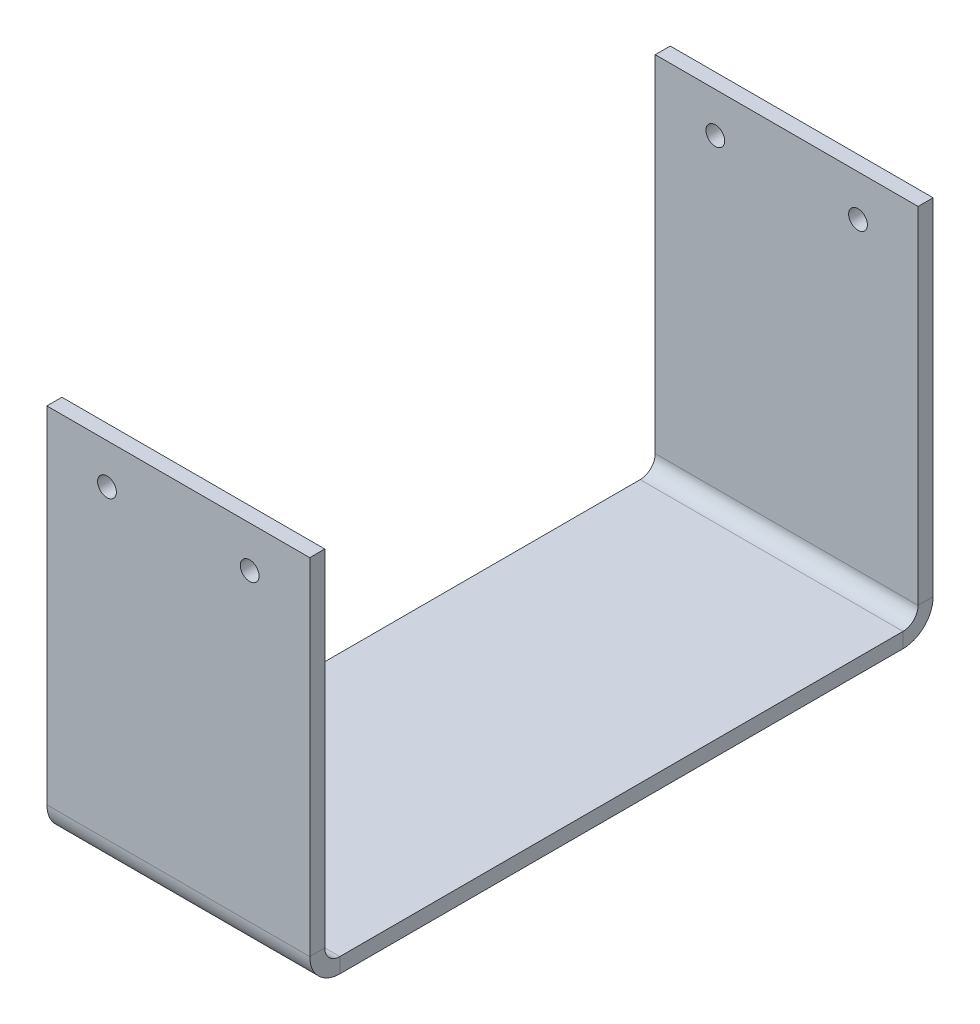
ISO-10303-21;
HEADER;
FILE_DESCRIPTION(('STEP AP214'),'2;1');
FILE_NAME('part.step','',(''),(''),'','','');
FILE_SCHEMA(('AUTOMOTIVE_DESIGN { 1 0 10303 214 1 1 1 1 }'));
ENDSEC;
DATA;
#1=APPLICATION_CONTEXT('core data for automotive mechanical design processes');
#2=APPLICATION_PROTOCOL_DEFINITION('international standard','automotive_design',2000,#1);
#3=PRODUCT_CONTEXT('',#1,'mechanical');
#4=PRODUCT('Part','Part','',(#3));
#5=PRODUCT_RELATED_PRODUCT_CATEGORY('part','',(#4));
#6=PRODUCT_DEFINITION_FORMATION('','',#4);
#7=PRODUCT_DEFINITION_CONTEXT('part definition',#1,'design');
#8=PRODUCT_DEFINITION('design','',#6,#7);
#9=PRODUCT_DEFINITION_SHAPE('','',#8);
#10=(LENGTH_UNIT() NAMED_UNIT(*) SI_UNIT(.MILLI.,.METRE.));
#11=(NAMED_UNIT(*) PLANE_ANGLE_UNIT() SI_UNIT($,.RADIAN.));
#12=(NAMED_UNIT(*) SI_UNIT($,.STERADIAN.) SOLID_ANGLE_UNIT());
#13=UNCERTAINTY_MEASURE_WITH_UNIT(LENGTH_MEASURE(1.E-05),#10,'distance_accuracy_value','');
#14=(GEOMETRIC_REPRESENTATION_CONTEXT(3) GLOBAL_UNCERTAINTY_ASSIGNED_CONTEXT((#13)) GLOBAL_UNIT_ASSIGNED_CONTEXT((#10,
#11,#12)) REPRESENTATION_CONTEXT('',''));
#15=CARTESIAN_POINT('',(0.,0.,0.));
#16=DIRECTION('',(0.,0.,1.));
#17=DIRECTION('',(1.,0.,0.));
#18=AXIS2_PLACEMENT_3D('',#15,#16,#17);
#19=CARTESIAN_POINT('',(0.,-2.,0.));
#20=DIRECTION('',(0.,1.,0.));
#21=DIRECTION('',(0.,0.,1.));
#22=AXIS2_PLACEMENT_3D('',#19,#20,#21);
#23=PLANE('',#22);
#24=DIRECTION('',(1.,0.,0.));
#25=VECTOR('',#24,1.);
#26=CARTESIAN_POINT('',(17.5,-2.00000000000001,37.5));
#27=LINE('',#26,#25);
#28=CARTESIAN_POINT('',(17.5,-2.00000000000001,37.5));
#29=VERTEX_POINT('',#28);
#30=CARTESIAN_POINT('',(-17.5,-2.,37.5));
#31=VERTEX_POINT('',#30);
#32=EDGE_CURVE('E210',#29,#31,#27,.F.);
#33=ORIENTED_EDGE('',*,*,#32,.T.);
#34=DIRECTION('',(0.,0.,1.));
#35=VECTOR('',#34,1.);
#36=CARTESIAN_POINT('',(-17.5,-2.,-41.5));
#37=LINE('',#36,#35);
#38=CARTESIAN_POINT('',(-17.5,-2.00000000000002,-37.5));
#39=VERTEX_POINT('',#38);
#40=EDGE_CURVE('E13',#39,#31,#37,.T.);
#41=ORIENTED_EDGE('',*,*,#40,.F.);
#42=DIRECTION('',(-1.,0.,0.));
#43=VECTOR('',#42,1.);
#44=CARTESIAN_POINT('',(-17.5,-2.00000000000002,-37.5));
#45=LINE('',#44,#43);
#46=CARTESIAN_POINT('',(17.5,-2.,-37.5));
#47=VERTEX_POINT('',#46);
#48=EDGE_CURVE('E263',#39,#47,#45,.F.);
#49=ORIENTED_EDGE('',*,*,#48,.T.);
#50=DIRECTION('',(0.,0.,-1.));
#51=VECTOR('',#50,1.);
#52=CARTESIAN_POINT('',(17.5,-2.,-41.5));
#53=LINE('',#52,#51);
#54=EDGE_CURVE('E85',#29,#47,#53,.T.);
#55=ORIENTED_EDGE('',*,*,#54,.F.);
#56=EDGE_LOOP('',(#33,#41,#49,#55));
#57=FACE_BOUND('',#56,.T.);
#58=ADVANCED_FACE('F76',(#57),#23,.F.);
#59=CARTESIAN_POINT('',(0.,0.,0.));
#60=DIRECTION('',(0.,1.,0.));
#61=DIRECTION('',(0.,0.,1.));
#62=AXIS2_PLACEMENT_3D('',#59,#60,#61);
#63=PLANE('',#62);
#64=DIRECTION('',(0.,0.,1.));
#65=VECTOR('',#64,1.);
#66=CARTESIAN_POINT('',(-17.5,0.,-41.5));
#67=LINE('',#66,#65);
#68=CARTESIAN_POINT('',(-17.5,0.,-37.5));
#69=VERTEX_POINT('',#68);
#70=CARTESIAN_POINT('',(-17.5,0.,37.5));
#71=VERTEX_POINT('',#70);
#72=EDGE_CURVE('E80',#69,#71,#67,.T.);
#73=ORIENTED_EDGE('',*,*,#72,.T.);
#74=DIRECTION('',(1.,0.,0.));
#75=VECTOR('',#74,1.);
#76=CARTESIAN_POINT('',(17.5,0.,37.5));
#77=LINE('',#76,#75);
#78=CARTESIAN_POINT('',(17.5,0.,37.5));
#79=VERTEX_POINT('',#78);
#80=EDGE_CURVE('E222',#79,#71,#77,.F.);
#81=ORIENTED_EDGE('',*,*,#80,.F.);
#82=DIRECTION('',(0.,0.,-1.));
#83=VECTOR('',#82,1.);
#84=CARTESIAN_POINT('',(17.5,0.,-41.5));
#85=LINE('',#84,#83);
#86=CARTESIAN_POINT('',(17.5,0.,-37.5));
#87=VERTEX_POINT('',#86);
#88=EDGE_CURVE('E281',#79,#87,#85,.T.);
#89=ORIENTED_EDGE('',*,*,#88,.T.);
#90=DIRECTION('',(-1.,0.,0.));
#91=VECTOR('',#90,1.);
#92=CARTESIAN_POINT('',(-17.5,0.,-37.5));
#93=LINE('',#92,#91);
#94=EDGE_CURVE('E93',#69,#87,#93,.F.);
#95=ORIENTED_EDGE('',*,*,#94,.F.);
#96=EDGE_LOOP('',(#73,#81,#89,#95));
#97=FACE_BOUND('',#96,.T.);
#98=ADVANCED_FACE('F285',(#97),#63,.T.);
#99=CARTESIAN_POINT('',(17.5,-2.,-41.5));
#100=DIRECTION('',(1.,0.,0.));
#101=DIRECTION('',(0.,0.,-1.));
#102=AXIS2_PLACEMENT_3D('',#99,#100,#101);
#103=PLANE('',#102);
#104=ORIENTED_EDGE('',*,*,#88,.F.);
#105=DIRECTION('',(0.,-1.,0.));
#106=VECTOR('',#105,1.);
#107=CARTESIAN_POINT('',(17.5,0.,37.5));
#108=LINE('',#107,#106);
#109=EDGE_CURVE('E216',#79,#29,#108,.T.);
#110=ORIENTED_EDGE('',*,*,#109,.T.);
#111=ORIENTED_EDGE('',*,*,#54,.T.);
#112=DIRECTION('',(0.,-1.,0.));
#113=VECTOR('',#112,1.);
#114=CARTESIAN_POINT('',(17.5,0.,-37.5));
#115=LINE('',#114,#113);
#116=EDGE_CURVE('E278',#87,#47,#115,.T.);
#117=ORIENTED_EDGE('',*,*,#116,.F.);
#118=EDGE_LOOP('',(#104,#110,#111,#117));
#119=FACE_BOUND('',#118,.T.);
#120=ADVANCED_FACE('F78',(#119),#103,.T.);
#121=CARTESIAN_POINT('',(-17.5,-2.,-41.5));
#122=DIRECTION('',(-1.,0.,0.));
#123=DIRECTION('',(0.,0.,1.));
#124=AXIS2_PLACEMENT_3D('',#121,#122,#123);
#125=PLANE('',#124);
#126=DIRECTION('',(0.,-1.,0.));
#127=VECTOR('',#126,1.);
#128=CARTESIAN_POINT('',(-17.5,0.,37.5));
#129=LINE('',#128,#127);
#130=EDGE_CURVE('E228',#71,#31,#129,.T.);
#131=ORIENTED_EDGE('',*,*,#130,.F.);
#132=ORIENTED_EDGE('',*,*,#72,.F.);
#133=DIRECTION('',(0.,-1.,0.));
#134=VECTOR('',#133,1.);
#135=CARTESIAN_POINT('',(-17.5,0.,-37.5));
#136=LINE('',#135,#134);
#137=EDGE_CURVE('E269',#69,#39,#136,.T.);
#138=ORIENTED_EDGE('',*,*,#137,.T.);
#139=ORIENTED_EDGE('',*,*,#40,.T.);
#140=EDGE_LOOP('',(#131,#132,#138,#139));
#141=FACE_BOUND('',#140,.T.);
#142=ADVANCED_FACE('F355',(#141),#125,.T.);
#143=CARTESIAN_POINT('',(17.5,1.99999999999998,-37.5));
#144=DIRECTION('',(1.,0.,0.));
#145=DIRECTION('',(0.,0.,-1.));
#146=AXIS2_PLACEMENT_3D('',#143,#144,#145);
#147=PLANE('',#146);
#148=DIRECTION('',(0.,0.,1.));
#149=VECTOR('',#148,1.);
#150=CARTESIAN_POINT('',(17.5,2.00000000000001,-41.5));
#151=LINE('',#150,#149);
#152=CARTESIAN_POINT('',(17.5,1.99999999999997,-39.5));
#153=VERTEX_POINT('',#152);
#154=CARTESIAN_POINT('',(17.5,1.99999999999997,-41.5));
#155=VERTEX_POINT('',#154);
#156=EDGE_CURVE('E231',#153,#155,#151,.F.);
#157=ORIENTED_EDGE('',*,*,#156,.F.);
#158=CARTESIAN_POINT('',(17.5,1.99999999999998,-37.5));
#159=DIRECTION('',(-1.,0.,0.));
#160=DIRECTION('',(0.,0.,1.));
#161=AXIS2_PLACEMENT_3D('',#158,#159,#160);
#162=CIRCLE('',#161,2.);
#163=EDGE_CURVE('E272',#87,#153,#162,.F.);
#164=ORIENTED_EDGE('',*,*,#163,.F.);
#165=ORIENTED_EDGE('',*,*,#116,.T.);
#166=CARTESIAN_POINT('',(17.5,1.99999999999998,-37.5));
#167=DIRECTION('',(-1.,0.,0.));
#168=DIRECTION('',(0.,0.,1.));
#169=AXIS2_PLACEMENT_3D('',#166,#167,#168);
#170=CIRCLE('',#169,4.);
#171=EDGE_CURVE('E265',#47,#155,#170,.F.);
#172=ORIENTED_EDGE('',*,*,#171,.T.);
#173=EDGE_LOOP('',(#157,#164,#165,#172));
#174=FACE_BOUND('',#173,.T.);
#175=ADVANCED_FACE('F357',(#174),#147,.T.);
#176=CARTESIAN_POINT('',(-17.5,1.99999999999998,-37.5));
#177=DIRECTION('',(1.,0.,0.));
#178=DIRECTION('',(0.,0.,-1.));
#179=AXIS2_PLACEMENT_3D('',#176,#177,#178);
#180=PLANE('',#179);
#181=CARTESIAN_POINT('',(-17.5,1.99999999999998,-37.5));
#182=DIRECTION('',(-1.,0.,0.));
#183=DIRECTION('',(0.,0.,1.));
#184=AXIS2_PLACEMENT_3D('',#181,#182,#183);
#185=CIRCLE('',#184,2.);
#186=CARTESIAN_POINT('',(-17.5,1.99999999999997,-39.5));
#187=VERTEX_POINT('',#186);
#188=EDGE_CURVE('E236',#187,#69,#185,.T.);
#189=ORIENTED_EDGE('',*,*,#188,.F.);
#190=DIRECTION('',(0.,0.,1.));
#191=VECTOR('',#190,1.);
#192=CARTESIAN_POINT('',(-17.5,1.99999999999999,-39.5));
#193=LINE('',#192,#191);
#194=CARTESIAN_POINT('',(-17.5,2.00000000000001,-41.5));
#195=VERTEX_POINT('',#194);
#196=EDGE_CURVE('E256',#187,#195,#193,.F.);
#197=ORIENTED_EDGE('',*,*,#196,.T.);
#198=CARTESIAN_POINT('',(-17.5,1.99999999999998,-37.5));
#199=DIRECTION('',(-1.,0.,0.));
#200=DIRECTION('',(0.,0.,1.));
#201=AXIS2_PLACEMENT_3D('',#198,#199,#200);
#202=CIRCLE('',#201,4.);
#203=EDGE_CURVE('E266',#195,#39,#202,.T.);
#204=ORIENTED_EDGE('',*,*,#203,.T.);
#205=ORIENTED_EDGE('',*,*,#137,.F.);
#206=EDGE_LOOP('',(#189,#197,#204,#205));
#207=FACE_BOUND('',#206,.T.);
#208=ADVANCED_FACE('F353',(#207),#180,.F.);
#209=CARTESIAN_POINT('',(-17.5,1.99999999999998,-37.5));
#210=DIRECTION('',(-1.,0.,0.));
#211=DIRECTION('',(0.,0.,-1.));
#212=AXIS2_PLACEMENT_3D('',#209,#210,#211);
#213=CYLINDRICAL_SURFACE('',#212,4.);
#214=ORIENTED_EDGE('',*,*,#48,.F.);
#215=ORIENTED_EDGE('',*,*,#203,.F.);
#216=DIRECTION('',(-1.,0.,0.));
#217=VECTOR('',#216,1.);
#218=CARTESIAN_POINT('',(17.5,2.00000000000001,-41.5));
#219=LINE('',#218,#217);
#220=EDGE_CURVE('E254',#195,#155,#219,.F.);
#221=ORIENTED_EDGE('',*,*,#220,.T.);
#222=ORIENTED_EDGE('',*,*,#171,.F.);
#223=EDGE_LOOP('',(#214,#215,#221,#222));
#224=FACE_BOUND('',#223,.T.);
#225=ADVANCED_FACE('F398',(#224),#213,.T.);
#226=CARTESIAN_POINT('',(-17.5,1.99999999999998,-37.5));
#227=DIRECTION('',(-1.,0.,0.));
#228=DIRECTION('',(0.,0.,-1.));
#229=AXIS2_PLACEMENT_3D('',#226,#227,#228);
#230=CYLINDRICAL_SURFACE('',#229,2.);
#231=ORIENTED_EDGE('',*,*,#94,.T.);
#232=ORIENTED_EDGE('',*,*,#163,.T.);
#233=DIRECTION('',(-1.,0.,0.));
#234=VECTOR('',#233,1.);
#235=CARTESIAN_POINT('',(17.5,1.99999999999999,-39.5));
#236=LINE('',#235,#234);
#237=EDGE_CURVE('E259',#153,#187,#236,.T.);
#238=ORIENTED_EDGE('',*,*,#237,.T.);
#239=ORIENTED_EDGE('',*,*,#188,.T.);
#240=EDGE_LOOP('',(#231,#232,#238,#239));
#241=FACE_BOUND('',#240,.T.);
#242=ADVANCED_FACE('F396',(#241),#230,.F.);
#243=CARTESIAN_POINT('',(17.5,0.,-41.5));
#244=DIRECTION('',(-1.,0.,0.));
#245=DIRECTION('',(0.,0.,1.));
#246=AXIS2_PLACEMENT_3D('',#243,#244,#245);
#247=PLANE('',#246);
#248=ORIENTED_EDGE('',*,*,#156,.T.);
#249=DIRECTION('',(0.,-1.,0.));
#250=VECTOR('',#249,1.);
#251=CARTESIAN_POINT('',(17.5,-1.50965011183761E-13,-41.5));
#252=LINE('',#251,#250);
#253=CARTESIAN_POINT('',(17.5,48.,-41.5000000000002));
#254=VERTEX_POINT('',#253);
#255=EDGE_CURVE('E244',#254,#155,#252,.T.);
#256=ORIENTED_EDGE('',*,*,#255,.F.);
#257=DIRECTION('',(0.,0.,1.));
#258=VECTOR('',#257,1.);
#259=CARTESIAN_POINT('',(17.5,48.,-41.5000000000002));
#260=LINE('',#259,#258);
#261=CARTESIAN_POINT('',(17.5,48.,-39.5000000000002));
#262=VERTEX_POINT('',#261);
#263=EDGE_CURVE('E237',#254,#262,#260,.T.);
#264=ORIENTED_EDGE('',*,*,#263,.T.);
#265=DIRECTION('',(0.,1.,0.));
#266=VECTOR('',#265,1.);
#267=CARTESIAN_POINT('',(17.5,0.,-39.5));
#268=LINE('',#267,#266);
#269=EDGE_CURVE('E251',#262,#153,#268,.F.);
#270=ORIENTED_EDGE('',*,*,#269,.T.);
#271=EDGE_LOOP('',(#248,#256,#264,#270));
#272=FACE_BOUND('',#271,.T.);
#273=ADVANCED_FACE('F392',(#272),#247,.F.);
#274=CARTESIAN_POINT('',(-17.5,48.,-41.5000000000002));
#275=DIRECTION('',(1.,0.,0.));
#276=DIRECTION('',(0.,1.,0.));
#277=AXIS2_PLACEMENT_3D('',#274,#275,#276);
#278=PLANE('',#277);
#279=ORIENTED_EDGE('',*,*,#196,.F.);
#280=DIRECTION('',(0.,-1.,0.));
#281=VECTOR('',#280,1.);
#282=CARTESIAN_POINT('',(-17.5,48.,-39.5000000000002));
#283=LINE('',#282,#281);
#284=CARTESIAN_POINT('',(-17.5,48.,-39.5000000000002));
#285=VERTEX_POINT('',#284);
#286=EDGE_CURVE('E249',#187,#285,#283,.F.);
#287=ORIENTED_EDGE('',*,*,#286,.T.);
#288=DIRECTION('',(0.,0.,1.));
#289=VECTOR('',#288,1.);
#290=CARTESIAN_POINT('',(-17.5,48.,-41.5000000000002));
#291=LINE('',#290,#289);
#292=CARTESIAN_POINT('',(-17.5,48.,-41.5000000000002));
#293=VERTEX_POINT('',#292);
#294=EDGE_CURVE('E233',#293,#285,#291,.T.);
#295=ORIENTED_EDGE('',*,*,#294,.F.);
#296=DIRECTION('',(0.,1.,0.));
#297=VECTOR('',#296,1.);
#298=CARTESIAN_POINT('',(-17.5,-1.48435206114628E-13,-41.5));
#299=LINE('',#298,#297);
#300=EDGE_CURVE('E242',#195,#293,#299,.T.);
#301=ORIENTED_EDGE('',*,*,#300,.F.);
#302=EDGE_LOOP('',(#279,#287,#295,#301));
#303=FACE_BOUND('',#302,.T.);
#304=ADVANCED_FACE('F382',(#303),#278,.F.);
#305=CARTESIAN_POINT('',(0.,-1.50965011183761E-13,-41.5));
#306=DIRECTION('',(0.,0.,1.));
#307=DIRECTION('',(0.,-1.,0.));
#308=AXIS2_PLACEMENT_3D('',#305,#306,#307);
#309=PLANE('',#308);
#310=CARTESIAN_POINT('',(9.5,42.5,-41.5000000000001));
#311=DIRECTION('',(0.,0.,1.));
#312=DIRECTION('',(0.,-1.,0.));
#313=AXIS2_PLACEMENT_3D('',#310,#311,#312);
#314=CIRCLE('',#313,1.24999999999998);
#315=CARTESIAN_POINT('',(9.5,41.25,-41.5000000000001));
#316=VERTEX_POINT('',#315);
#317=EDGE_CURVE('E319',#316,#316,#314,.T.);
#318=ORIENTED_EDGE('',*,*,#317,.T.);
#319=EDGE_LOOP('',(#318));
#320=FACE_BOUND('',#319,.T.);
#321=CARTESIAN_POINT('',(-9.50000000000001,42.6701090036128,-41.5000000000001));
#322=DIRECTION('',(0.,0.,1.));
#323=DIRECTION('',(0.,-1.,0.));
#324=AXIS2_PLACEMENT_3D('',#321,#322,#323);
#325=CIRCLE('',#324,1.24999999999998);
#326=CARTESIAN_POINT('',(-9.50000000000001,41.4201090036128,-41.5000000000001));
#327=VERTEX_POINT('',#326);
#328=EDGE_CURVE('E209',#327,#327,#325,.T.);
#329=ORIENTED_EDGE('',*,*,#328,.T.);
#330=EDGE_LOOP('',(#329));
#331=FACE_BOUND('',#330,.T.);
#332=ORIENTED_EDGE('',*,*,#220,.F.);
#333=ORIENTED_EDGE('',*,*,#300,.T.);
#334=DIRECTION('',(1.,0.,0.));
#335=VECTOR('',#334,1.);
#336=CARTESIAN_POINT('',(0.,48.,-41.5000000000002));
#337=LINE('',#336,#335);
#338=EDGE_CURVE('E240',#293,#254,#337,.T.);
#339=ORIENTED_EDGE('',*,*,#338,.T.);
#340=ORIENTED_EDGE('',*,*,#255,.T.);
#341=EDGE_LOOP('',(#332,#333,#339,#340));
#342=FACE_BOUND('',#341,.T.);
#343=ADVANCED_FACE('F378',(#320,#331,#342),#309,.F.);
#344=CARTESIAN_POINT('',(0.,-1.43982048506075E-13,-39.5));
#345=DIRECTION('',(0.,0.,1.));
#346=DIRECTION('',(0.,-1.,0.));
#347=AXIS2_PLACEMENT_3D('',#344,#345,#346);
#348=PLANE('',#347);
#349=CARTESIAN_POINT('',(9.5,42.5,-39.5000000000001));
#350=DIRECTION('',(0.,0.,1.));
#351=DIRECTION('',(0.,-1.,0.));
#352=AXIS2_PLACEMENT_3D('',#349,#350,#351);
#353=CIRCLE('',#352,1.24999999999998);
#354=CARTESIAN_POINT('',(9.5,41.25,-39.5000000000001));
#355=VERTEX_POINT('',#354);
#356=EDGE_CURVE('E316',#355,#355,#353,.T.);
#357=ORIENTED_EDGE('',*,*,#356,.F.);
#358=EDGE_LOOP('',(#357));
#359=FACE_BOUND('',#358,.T.);
#360=CARTESIAN_POINT('',(-9.50000000000001,42.6701090036128,-39.5000000000001));
#361=DIRECTION('',(0.,0.,1.));
#362=DIRECTION('',(0.,-1.,0.));
#363=AXIS2_PLACEMENT_3D('',#360,#361,#362);
#364=CIRCLE('',#363,1.24999999999998);
#365=CARTESIAN_POINT('',(-9.50000000000001,41.4201090036129,-39.5000000000001));
#366=VERTEX_POINT('',#365);
#367=EDGE_CURVE('E310',#366,#366,#364,.T.);
#368=ORIENTED_EDGE('',*,*,#367,.F.);
#369=EDGE_LOOP('',(#368));
#370=FACE_BOUND('',#369,.T.);
#371=ORIENTED_EDGE('',*,*,#286,.F.);
#372=ORIENTED_EDGE('',*,*,#237,.F.);
#373=ORIENTED_EDGE('',*,*,#269,.F.);
#374=DIRECTION('',(-1.,0.,0.));
#375=VECTOR('',#374,1.);
#376=CARTESIAN_POINT('',(17.5,48.,-39.5000000000002));
#377=LINE('',#376,#375);
#378=EDGE_CURVE('E247',#285,#262,#377,.F.);
#379=ORIENTED_EDGE('',*,*,#378,.F.);
#380=EDGE_LOOP('',(#371,#372,#373,#379));
#381=FACE_BOUND('',#380,.T.);
#382=ADVANCED_FACE('F381',(#359,#370,#381),#348,.T.);
#383=CARTESIAN_POINT('',(17.5,48.,-41.5000000000002));
#384=DIRECTION('',(0.,-1.,0.));
#385=DIRECTION('',(0.,0.,-1.));
#386=AXIS2_PLACEMENT_3D('',#383,#384,#385);
#387=PLANE('',#386);
#388=ORIENTED_EDGE('',*,*,#378,.T.);
#389=ORIENTED_EDGE('',*,*,#263,.F.);
#390=ORIENTED_EDGE('',*,*,#338,.F.);
#391=ORIENTED_EDGE('',*,*,#294,.T.);
#392=EDGE_LOOP('',(#388,#389,#390,#391));
#393=FACE_BOUND('',#392,.T.);
#394=ADVANCED_FACE('F374',(#393),#387,.F.);
#395=CARTESIAN_POINT('',(-17.5,1.99999999999999,37.5));
#396=DIRECTION('',(-1.,0.,0.));
#397=DIRECTION('',(0.,0.,1.));
#398=AXIS2_PLACEMENT_3D('',#395,#396,#397);
#399=PLANE('',#398);
#400=DIRECTION('',(0.,0.,-1.));
#401=VECTOR('',#400,1.);
#402=CARTESIAN_POINT('',(-17.5,1.99999999999999,41.5));
#403=LINE('',#402,#401);
#404=CARTESIAN_POINT('',(-17.5,1.99999999999999,39.5));
#405=VERTEX_POINT('',#404);
#406=CARTESIAN_POINT('',(-17.5,1.99999999999999,41.5));
#407=VERTEX_POINT('',#406);
#408=EDGE_CURVE('E192',#405,#407,#403,.F.);
#409=ORIENTED_EDGE('',*,*,#408,.F.);
#410=CARTESIAN_POINT('',(-17.5,1.99999999999999,37.5));
#411=DIRECTION('',(1.,0.,0.));
#412=DIRECTION('',(0.,0.,-1.));
#413=AXIS2_PLACEMENT_3D('',#410,#411,#412);
#414=CIRCLE('',#413,2.);
#415=EDGE_CURVE('E219',#71,#405,#414,.F.);
#416=ORIENTED_EDGE('',*,*,#415,.F.);
#417=ORIENTED_EDGE('',*,*,#130,.T.);
#418=CARTESIAN_POINT('',(-17.5,1.99999999999999,37.5));
#419=DIRECTION('',(1.,0.,0.));
#420=DIRECTION('',(0.,0.,-1.));
#421=AXIS2_PLACEMENT_3D('',#418,#419,#420);
#422=CIRCLE('',#421,4.);
#423=EDGE_CURVE('E212',#31,#407,#422,.F.);
#424=ORIENTED_EDGE('',*,*,#423,.T.);
#425=EDGE_LOOP('',(#409,#416,#417,#424));
#426=FACE_BOUND('',#425,.T.);
#427=ADVANCED_FACE('F294',(#426),#399,.T.);
#428=CARTESIAN_POINT('',(17.5,1.99999999999999,37.5));
#429=DIRECTION('',(-1.,0.,0.));
#430=DIRECTION('',(0.,0.,1.));
#431=AXIS2_PLACEMENT_3D('',#428,#429,#430);
#432=PLANE('',#431);
#433=CARTESIAN_POINT('',(17.5,1.99999999999999,37.5));
#434=DIRECTION('',(1.,0.,0.));
#435=DIRECTION('',(0.,0.,-1.));
#436=AXIS2_PLACEMENT_3D('',#433,#434,#435);
#437=CIRCLE('',#436,2.);
#438=CARTESIAN_POINT('',(17.5,1.99999999999999,39.5));
#439=VERTEX_POINT('',#438);
#440=EDGE_CURVE('E225',#439,#79,#437,.T.);
#441=ORIENTED_EDGE('',*,*,#440,.F.);
#442=DIRECTION('',(0.,0.,-1.));
#443=VECTOR('',#442,1.);
#444=CARTESIAN_POINT('',(17.5,1.99999999999999,39.5));
#445=LINE('',#444,#443);
#446=CARTESIAN_POINT('',(17.5,1.99999999999999,41.5));
#447=VERTEX_POINT('',#446);
#448=EDGE_CURVE('E203',#439,#447,#445,.F.);
#449=ORIENTED_EDGE('',*,*,#448,.T.);
#450=CARTESIAN_POINT('',(17.5,1.99999999999999,37.5));
#451=DIRECTION('',(1.,0.,0.));
#452=DIRECTION('',(0.,0.,-1.));
#453=AXIS2_PLACEMENT_3D('',#450,#451,#452);
#454=CIRCLE('',#453,4.);
#455=EDGE_CURVE('E213',#447,#29,#454,.T.);
#456=ORIENTED_EDGE('',*,*,#455,.T.);
#457=ORIENTED_EDGE('',*,*,#109,.F.);
#458=EDGE_LOOP('',(#441,#449,#456,#457));
#459=FACE_BOUND('',#458,.T.);
#460=ADVANCED_FACE('F366',(#459),#432,.F.);
#461=CARTESIAN_POINT('',(17.5,1.99999999999999,37.5));
#462=DIRECTION('',(1.,0.,0.));
#463=DIRECTION('',(0.,0.,1.));
#464=AXIS2_PLACEMENT_3D('',#461,#462,#463);
#465=CYLINDRICAL_SURFACE('',#464,4.);
#466=ORIENTED_EDGE('',*,*,#32,.F.);
#467=ORIENTED_EDGE('',*,*,#455,.F.);
#468=DIRECTION('',(1.,0.,0.));
#469=VECTOR('',#468,1.);
#470=CARTESIAN_POINT('',(-17.5,1.99999999999999,41.5));
#471=LINE('',#470,#469);
#472=EDGE_CURVE('E201',#447,#407,#471,.F.);
#473=ORIENTED_EDGE('',*,*,#472,.T.);
#474=ORIENTED_EDGE('',*,*,#423,.F.);
#475=EDGE_LOOP('',(#466,#467,#473,#474));
#476=FACE_BOUND('',#475,.T.);
#477=ADVANCED_FACE('F298',(#476),#465,.T.);
#478=CARTESIAN_POINT('',(17.5,1.99999999999999,37.5));
#479=DIRECTION('',(1.,0.,0.));
#480=DIRECTION('',(0.,0.,1.));
#481=AXIS2_PLACEMENT_3D('',#478,#479,#480);
#482=CYLINDRICAL_SURFACE('',#481,2.);
#483=ORIENTED_EDGE('',*,*,#80,.T.);
#484=ORIENTED_EDGE('',*,*,#415,.T.);
#485=DIRECTION('',(1.,0.,0.));
#486=VECTOR('',#485,1.);
#487=CARTESIAN_POINT('',(-17.5,1.99999999999999,39.5));
#488=LINE('',#487,#486);
#489=EDGE_CURVE('E206',#405,#439,#488,.T.);
#490=ORIENTED_EDGE('',*,*,#489,.T.);
#491=ORIENTED_EDGE('',*,*,#440,.T.);
#492=EDGE_LOOP('',(#483,#484,#490,#491));
#493=FACE_BOUND('',#492,.T.);
#494=ADVANCED_FACE('F290',(#493),#482,.F.);
#495=CARTESIAN_POINT('',(-17.5,0.,41.5));
#496=DIRECTION('',(1.,0.,0.));
#497=DIRECTION('',(0.,0.,-1.));
#498=AXIS2_PLACEMENT_3D('',#495,#496,#497);
#499=PLANE('',#498);
#500=ORIENTED_EDGE('',*,*,#408,.T.);
#501=DIRECTION('',(0.,-1.,0.));
#502=VECTOR('',#501,1.);
#503=CARTESIAN_POINT('',(-17.5,0.,41.5));
#504=LINE('',#503,#502);
#505=CARTESIAN_POINT('',(-17.5,48.,41.5));
#506=VERTEX_POINT('',#505);
#507=EDGE_CURVE('E173',#506,#407,#504,.T.);
#508=ORIENTED_EDGE('',*,*,#507,.F.);
#509=DIRECTION('',(0.,0.,-1.));
#510=VECTOR('',#509,1.);
#511=CARTESIAN_POINT('',(-17.5,48.,41.5));
#512=LINE('',#511,#510);
#513=CARTESIAN_POINT('',(-17.5,48.,39.5));
#514=VERTEX_POINT('',#513);
#515=EDGE_CURVE('E179',#506,#514,#512,.T.);
#516=ORIENTED_EDGE('',*,*,#515,.T.);
#517=DIRECTION('',(0.,1.,0.));
#518=VECTOR('',#517,1.);
#519=CARTESIAN_POINT('',(-17.5,0.,39.5));
#520=LINE('',#519,#518);
#521=EDGE_CURVE('E199',#514,#405,#520,.F.);
#522=ORIENTED_EDGE('',*,*,#521,.T.);
#523=EDGE_LOOP('',(#500,#508,#516,#522));
#524=FACE_BOUND('',#523,.T.);
#525=ADVANCED_FACE('F191',(#524),#499,.F.);
#526=CARTESIAN_POINT('',(17.5,48.,41.5));
#527=DIRECTION('',(-1.,0.,0.));
#528=DIRECTION('',(0.,-1.,0.));
#529=AXIS2_PLACEMENT_3D('',#526,#527,#528);
#530=PLANE('',#529);
#531=ORIENTED_EDGE('',*,*,#448,.F.);
#532=DIRECTION('',(0.,-1.,0.));
#533=VECTOR('',#532,1.);
#534=CARTESIAN_POINT('',(17.5,48.,39.5));
#535=LINE('',#534,#533);
#536=CARTESIAN_POINT('',(17.5,48.,39.5));
#537=VERTEX_POINT('',#536);
#538=EDGE_CURVE('E195',#439,#537,#535,.F.);
#539=ORIENTED_EDGE('',*,*,#538,.T.);
#540=DIRECTION('',(0.,0.,-1.));
#541=VECTOR('',#540,1.);
#542=CARTESIAN_POINT('',(17.5,48.,41.5));
#543=LINE('',#542,#541);
#544=CARTESIAN_POINT('',(17.5,48.,41.5));
#545=VERTEX_POINT('',#544);
#546=EDGE_CURVE('E188',#545,#537,#543,.T.);
#547=ORIENTED_EDGE('',*,*,#546,.F.);
#548=DIRECTION('',(0.,1.,0.));
#549=VECTOR('',#548,1.);
#550=CARTESIAN_POINT('',(17.5,0.,41.5));
#551=LINE('',#550,#549);
#552=EDGE_CURVE('E175',#447,#545,#551,.T.);
#553=ORIENTED_EDGE('',*,*,#552,.F.);
#554=EDGE_LOOP('',(#531,#539,#547,#553));
#555=FACE_BOUND('',#554,.T.);
#556=ADVANCED_FACE('F301',(#555),#530,.F.);
#557=CARTESIAN_POINT('',(0.,0.,41.5));
#558=DIRECTION('',(0.,0.,-1.));
#559=DIRECTION('',(-1.,0.,0.));
#560=AXIS2_PLACEMENT_3D('',#557,#558,#559);
#561=PLANE('',#560);
#562=CARTESIAN_POINT('',(9.5,42.5000000000003,41.5));
#563=DIRECTION('',(0.,0.,-1.));
#564=DIRECTION('',(0.,1.,0.));
#565=AXIS2_PLACEMENT_3D('',#562,#563,#564);
#566=CIRCLE('',#565,1.24999999999998);
#567=CARTESIAN_POINT('',(9.5,43.7500000000003,41.5));
#568=VERTEX_POINT('',#567);
#569=EDGE_CURVE('E325',#568,#568,#566,.T.);
#570=ORIENTED_EDGE('',*,*,#569,.T.);
#571=EDGE_LOOP('',(#570));
#572=FACE_BOUND('',#571,.T.);
#573=CARTESIAN_POINT('',(-9.50000000000001,42.6701090036131,41.5));
#574=DIRECTION('',(0.,0.,-1.));
#575=DIRECTION('',(0.,1.,0.));
#576=AXIS2_PLACEMENT_3D('',#573,#574,#575);
#577=CIRCLE('',#576,1.24999999999998);
#578=CARTESIAN_POINT('',(-9.50000000000001,43.9201090036131,41.5));
#579=VERTEX_POINT('',#578);
#580=EDGE_CURVE('E313',#579,#579,#577,.T.);
#581=ORIENTED_EDGE('',*,*,#580,.T.);
#582=EDGE_LOOP('',(#581));
#583=FACE_BOUND('',#582,.T.);
#584=ORIENTED_EDGE('',*,*,#472,.F.);
#585=ORIENTED_EDGE('',*,*,#552,.T.);
#586=DIRECTION('',(-1.,0.,0.));
#587=VECTOR('',#586,1.);
#588=CARTESIAN_POINT('',(0.,48.,41.5));
#589=LINE('',#588,#587);
#590=EDGE_CURVE('E168',#545,#506,#589,.T.);
#591=ORIENTED_EDGE('',*,*,#590,.T.);
#592=ORIENTED_EDGE('',*,*,#507,.T.);
#593=EDGE_LOOP('',(#584,#585,#591,#592));
#594=FACE_BOUND('',#593,.T.);
#595=ADVANCED_FACE('F171',(#572,#583,#594),#561,.F.);
#596=CARTESIAN_POINT('',(0.,0.,39.5));
#597=DIRECTION('',(0.,0.,-1.));
#598=DIRECTION('',(-1.,0.,0.));
#599=AXIS2_PLACEMENT_3D('',#596,#597,#598);
#600=PLANE('',#599);
#601=CARTESIAN_POINT('',(9.5,42.5000000000003,39.5));
#602=DIRECTION('',(0.,0.,-1.));
#603=DIRECTION('',(-1.,0.,0.));
#604=AXIS2_PLACEMENT_3D('',#601,#602,#603);
#605=CIRCLE('',#604,1.24999999999998);
#606=CARTESIAN_POINT('',(8.25000000000002,42.5000000000003,39.5));
#607=VERTEX_POINT('',#606);
#608=EDGE_CURVE('E322',#607,#607,#605,.T.);
#609=ORIENTED_EDGE('',*,*,#608,.F.);
#610=EDGE_LOOP('',(#609));
#611=FACE_BOUND('',#610,.T.);
#612=CARTESIAN_POINT('',(-9.50000000000001,42.6701090036131,39.5));
#613=DIRECTION('',(0.,0.,-1.));
#614=DIRECTION('',(-1.,0.,0.));
#615=AXIS2_PLACEMENT_3D('',#612,#613,#614);
#616=CIRCLE('',#615,1.24999999999998);
#617=CARTESIAN_POINT('',(-10.75,42.6701090036131,39.5));
#618=VERTEX_POINT('',#617);
#619=EDGE_CURVE('E307',#618,#618,#616,.T.);
#620=ORIENTED_EDGE('',*,*,#619,.F.);
#621=EDGE_LOOP('',(#620));
#622=FACE_BOUND('',#621,.T.);
#623=ORIENTED_EDGE('',*,*,#538,.F.);
#624=ORIENTED_EDGE('',*,*,#489,.F.);
#625=ORIENTED_EDGE('',*,*,#521,.F.);
#626=DIRECTION('',(1.,0.,0.));
#627=VECTOR('',#626,1.);
#628=CARTESIAN_POINT('',(-17.5,48.,39.5));
#629=LINE('',#628,#627);
#630=EDGE_CURVE('E184',#537,#514,#629,.F.);
#631=ORIENTED_EDGE('',*,*,#630,.F.);
#632=EDGE_LOOP('',(#623,#624,#625,#631));
#633=FACE_BOUND('',#632,.T.);
#634=ADVANCED_FACE('F518',(#611,#622,#633),#600,.T.);
#635=CARTESIAN_POINT('',(-17.5,48.,41.5));
#636=DIRECTION('',(0.,-1.,0.));
#637=DIRECTION('',(0.,0.,-1.));
#638=AXIS2_PLACEMENT_3D('',#635,#636,#637);
#639=PLANE('',#638);
#640=ORIENTED_EDGE('',*,*,#630,.T.);
#641=ORIENTED_EDGE('',*,*,#515,.F.);
#642=ORIENTED_EDGE('',*,*,#590,.F.);
#643=ORIENTED_EDGE('',*,*,#546,.T.);
#644=EDGE_LOOP('',(#640,#641,#642,#643));
#645=FACE_BOUND('',#644,.T.);
#646=ADVANCED_FACE('F182',(#645),#639,.F.);
#647=CARTESIAN_POINT('',(-9.50000000000001,42.6701090036128,-43.5000000000001));
#648=DIRECTION('',(0.,0.,-1.));
#649=DIRECTION('',(0.,1.,0.));
#650=AXIS2_PLACEMENT_3D('',#647,#648,#649);
#651=CYLINDRICAL_SURFACE('',#650,1.24999999999998);
#652=ORIENTED_EDGE('',*,*,#619,.T.);
#653=EDGE_LOOP('',(#652));
#654=FACE_BOUND('',#653,.T.);
#655=ORIENTED_EDGE('',*,*,#580,.F.);
#656=EDGE_LOOP('',(#655));
#657=FACE_BOUND('',#656,.T.);
#658=ADVANCED_FACE('F342',(#654,#657),#651,.F.);
#659=ORIENTED_EDGE('',*,*,#367,.T.);
#660=EDGE_LOOP('',(#659));
#661=FACE_BOUND('',#660,.T.);
#662=ORIENTED_EDGE('',*,*,#328,.F.);
#663=EDGE_LOOP('',(#662));
#664=FACE_BOUND('',#663,.T.);
#665=ADVANCED_FACE('F334',(#661,#664),#651,.F.);
#666=CARTESIAN_POINT('',(9.5,42.5,-43.5000000000001));
#667=DIRECTION('',(0.,0.,-1.));
#668=DIRECTION('',(0.,1.,0.));
#669=AXIS2_PLACEMENT_3D('',#666,#667,#668);
#670=CYLINDRICAL_SURFACE('',#669,1.24999999999998);
#671=ORIENTED_EDGE('',*,*,#608,.T.);
#672=EDGE_LOOP('',(#671));
#673=FACE_BOUND('',#672,.T.);
#674=ORIENTED_EDGE('',*,*,#569,.F.);
#675=EDGE_LOOP('',(#674));
#676=FACE_BOUND('',#675,.T.);
#677=ADVANCED_FACE('F331',(#673,#676),#670,.F.);
#678=ORIENTED_EDGE('',*,*,#356,.T.);
#679=EDGE_LOOP('',(#678));
#680=FACE_BOUND('',#679,.T.);
#681=ORIENTED_EDGE('',*,*,#317,.F.);
#682=EDGE_LOOP('',(#681));
#683=FACE_BOUND('',#682,.T.);
#684=ADVANCED_FACE('F333',(#680,#683),#670,.F.);
#685=CLOSED_SHELL('',(#58,#98,#120,#142,#175,#208,#225,#242,#273,#304,#343,#382,#394,#427,#460,
#477,#494,#525,#556,#595,#634,#646,#658,#665,#677,#684));
#686=MANIFOLD_SOLID_BREP('B2',#685);
#687=ADVANCED_BREP_SHAPE_REPRESENTATION('',(#18,#686),#14);
#688=SHAPE_DEFINITION_REPRESENTATION(#9,#687);
ENDSEC;
END-ISO-10303-21;
